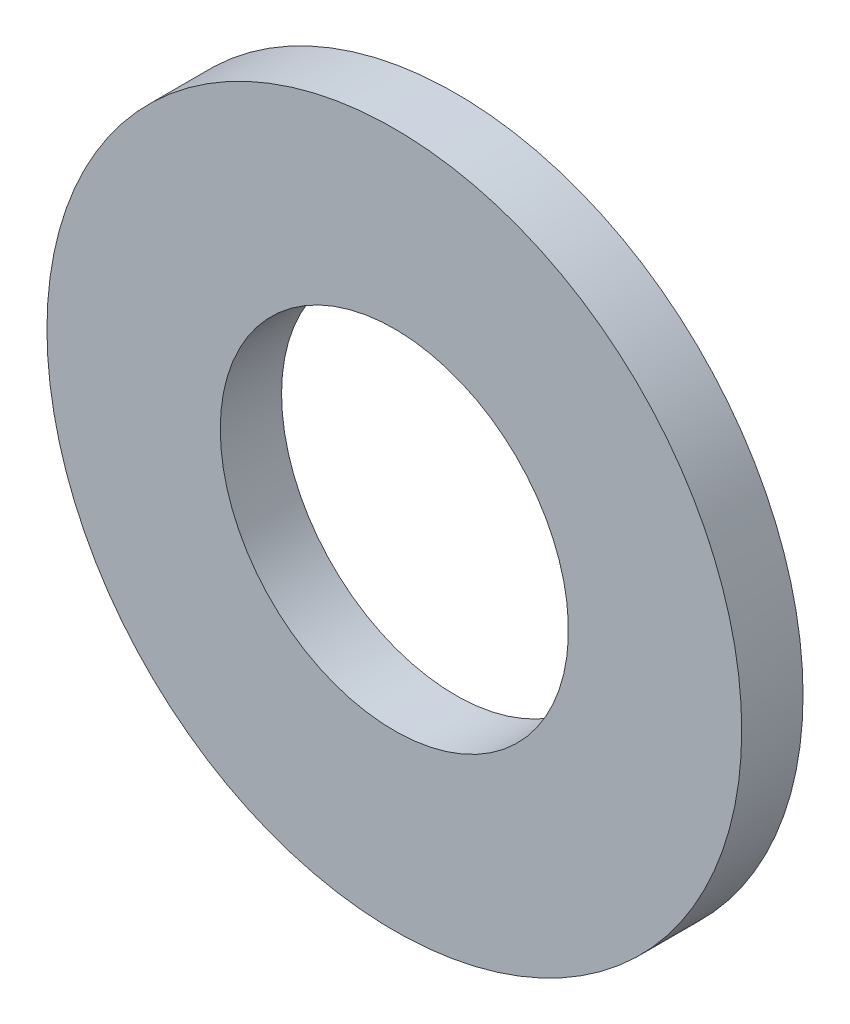
ISO-10303-21;
HEADER;
FILE_DESCRIPTION(('STEP AP214'),'2;1');
FILE_NAME('part.step','',(''),(''),'','','');
FILE_SCHEMA(('AUTOMOTIVE_DESIGN { 1 0 10303 214 1 1 1 1 }'));
ENDSEC;
DATA;
#1=APPLICATION_CONTEXT('core data for automotive mechanical design processes');
#2=APPLICATION_PROTOCOL_DEFINITION('international standard','automotive_design',2000,#1);
#3=PRODUCT_CONTEXT('',#1,'mechanical');
#4=PRODUCT('Part','Part','',(#3));
#5=PRODUCT_RELATED_PRODUCT_CATEGORY('part','',(#4));
#6=PRODUCT_DEFINITION_FORMATION('','',#4);
#7=PRODUCT_DEFINITION_CONTEXT('part definition',#1,'design');
#8=PRODUCT_DEFINITION('design','',#6,#7);
#9=PRODUCT_DEFINITION_SHAPE('','',#8);
#10=(LENGTH_UNIT() NAMED_UNIT(*) SI_UNIT(.MILLI.,.METRE.));
#11=(NAMED_UNIT(*) PLANE_ANGLE_UNIT() SI_UNIT($,.RADIAN.));
#12=(NAMED_UNIT(*) SI_UNIT($,.STERADIAN.) SOLID_ANGLE_UNIT());
#13=UNCERTAINTY_MEASURE_WITH_UNIT(LENGTH_MEASURE(1.E-05),#10,'distance_accuracy_value','');
#14=(GEOMETRIC_REPRESENTATION_CONTEXT(3) GLOBAL_UNCERTAINTY_ASSIGNED_CONTEXT((#13)) GLOBAL_UNIT_ASSIGNED_CONTEXT((#10,
#11,#12)) REPRESENTATION_CONTEXT('',''));
#15=CARTESIAN_POINT('',(0.,0.,0.));
#16=DIRECTION('',(0.,0.,1.));
#17=DIRECTION('',(1.,0.,0.));
#18=AXIS2_PLACEMENT_3D('',#15,#16,#17);
#19=CARTESIAN_POINT('',(0.,0.,0.78));
#20=DIRECTION('',(0.,0.,1.));
#21=DIRECTION('',(1.,0.,0.));
#22=AXIS2_PLACEMENT_3D('',#19,#20,#21);
#23=PLANE('',#22);
#24=CARTESIAN_POINT('',(0.,0.,0.78));
#25=DIRECTION('',(0.,0.,1.));
#26=DIRECTION('',(1.,0.,0.));
#27=AXIS2_PLACEMENT_3D('',#24,#25,#26);
#28=CIRCLE('',#27,4.42);
#29=CARTESIAN_POINT('',(-4.42,0.,0.78));
#30=VERTEX_POINT('',#29);
#31=EDGE_CURVE('E10',#30,#30,#28,.T.);
#32=ORIENTED_EDGE('',*,*,#31,.T.);
#33=EDGE_LOOP('',(#32));
#34=FACE_BOUND('',#33,.T.);
#35=CARTESIAN_POINT('',(0.,0.,0.78));
#36=DIRECTION('',(0.,0.,1.));
#37=DIRECTION('',(1.,0.,0.));
#38=AXIS2_PLACEMENT_3D('',#35,#36,#37);
#39=CIRCLE('',#38,2.215);
#40=CARTESIAN_POINT('',(-2.215,0.,0.78));
#41=VERTEX_POINT('',#40);
#42=EDGE_CURVE('E43',#41,#41,#39,.T.);
#43=ORIENTED_EDGE('',*,*,#42,.F.);
#44=EDGE_LOOP('',(#43));
#45=FACE_BOUND('',#44,.T.);
#46=ADVANCED_FACE('F32',(#34,#45),#23,.T.);
#47=CARTESIAN_POINT('',(0.,0.,0.));
#48=DIRECTION('',(0.,0.,1.));
#49=DIRECTION('',(1.,0.,0.));
#50=AXIS2_PLACEMENT_3D('',#47,#48,#49);
#51=PLANE('',#50);
#52=CARTESIAN_POINT('',(0.,0.,0.));
#53=DIRECTION('',(0.,0.,1.));
#54=DIRECTION('',(1.,0.,0.));
#55=AXIS2_PLACEMENT_3D('',#52,#53,#54);
#56=CIRCLE('',#55,4.42);
#57=CARTESIAN_POINT('',(-4.42,0.,0.));
#58=VERTEX_POINT('',#57);
#59=EDGE_CURVE('E36',#58,#58,#56,.T.);
#60=ORIENTED_EDGE('',*,*,#59,.F.);
#61=EDGE_LOOP('',(#60));
#62=FACE_BOUND('',#61,.T.);
#63=CARTESIAN_POINT('',(0.,0.,0.));
#64=DIRECTION('',(0.,0.,1.));
#65=DIRECTION('',(1.,0.,0.));
#66=AXIS2_PLACEMENT_3D('',#63,#64,#65);
#67=CIRCLE('',#66,2.215);
#68=CARTESIAN_POINT('',(-2.215,0.,0.));
#69=VERTEX_POINT('',#68);
#70=EDGE_CURVE('E45',#69,#69,#67,.T.);
#71=ORIENTED_EDGE('',*,*,#70,.T.);
#72=EDGE_LOOP('',(#71));
#73=FACE_BOUND('',#72,.T.);
#74=ADVANCED_FACE('F55',(#62,#73),#51,.F.);
#75=CARTESIAN_POINT('',(0.,0.,0.78));
#76=DIRECTION('',(0.,0.,-1.));
#77=DIRECTION('',(-1.,0.,0.));
#78=AXIS2_PLACEMENT_3D('',#75,#76,#77);
#79=CYLINDRICAL_SURFACE('',#78,4.42);
#80=CARTESIAN_POINT('',(-4.42,0.,0.78));
#81=CARTESIAN_POINT('',(-4.42,0.,0.771875));
#82=CARTESIAN_POINT('',(-4.42,0.,0.76375));
#83=CARTESIAN_POINT('',(-4.42,0.,0.7475));
#84=CARTESIAN_POINT('',(-4.42,0.,0.739375));
#85=CARTESIAN_POINT('',(-4.42,0.,0.723125));
#86=CARTESIAN_POINT('',(-4.42,0.,0.715));
#87=CARTESIAN_POINT('',(-4.42,0.,0.69875));
#88=CARTESIAN_POINT('',(-4.42,0.,0.690625));
#89=CARTESIAN_POINT('',(-4.42,0.,0.674375));
#90=CARTESIAN_POINT('',(-4.42,0.,0.66625));
#91=CARTESIAN_POINT('',(-4.42,0.,0.65));
#92=CARTESIAN_POINT('',(-4.42,0.,0.641875));
#93=CARTESIAN_POINT('',(-4.42,0.,0.625625));
#94=CARTESIAN_POINT('',(-4.42,0.,0.6175));
#95=CARTESIAN_POINT('',(-4.42,0.,0.60125));
#96=CARTESIAN_POINT('',(-4.42,0.,0.593125));
#97=CARTESIAN_POINT('',(-4.42,0.,0.576875));
#98=CARTESIAN_POINT('',(-4.42,0.,0.56875));
#99=CARTESIAN_POINT('',(-4.42,0.,0.5525));
#100=CARTESIAN_POINT('',(-4.42,0.,0.544375));
#101=CARTESIAN_POINT('',(-4.42,0.,0.528125));
#102=CARTESIAN_POINT('',(-4.42,0.,0.52));
#103=CARTESIAN_POINT('',(-4.42,0.,0.50375));
#104=CARTESIAN_POINT('',(-4.42,0.,0.495625));
#105=CARTESIAN_POINT('',(-4.42,0.,0.479375));
#106=CARTESIAN_POINT('',(-4.42,0.,0.47125));
#107=CARTESIAN_POINT('',(-4.42,0.,0.455));
#108=CARTESIAN_POINT('',(-4.42,0.,0.446875));
#109=CARTESIAN_POINT('',(-4.42,0.,0.430625));
#110=CARTESIAN_POINT('',(-4.42,0.,0.4225));
#111=CARTESIAN_POINT('',(-4.42,0.,0.40625));
#112=CARTESIAN_POINT('',(-4.42,0.,0.398125));
#113=CARTESIAN_POINT('',(-4.42,0.,0.381875));
#114=CARTESIAN_POINT('',(-4.42,0.,0.37375));
#115=CARTESIAN_POINT('',(-4.42,0.,0.3575));
#116=CARTESIAN_POINT('',(-4.42,0.,0.349375));
#117=CARTESIAN_POINT('',(-4.42,0.,0.333125));
#118=CARTESIAN_POINT('',(-4.42,0.,0.325));
#119=CARTESIAN_POINT('',(-4.42,0.,0.30875));
#120=CARTESIAN_POINT('',(-4.42,0.,0.300625));
#121=CARTESIAN_POINT('',(-4.42,0.,0.284375));
#122=CARTESIAN_POINT('',(-4.42,0.,0.27625));
#123=CARTESIAN_POINT('',(-4.42,0.,0.26));
#124=CARTESIAN_POINT('',(-4.42,0.,0.251875));
#125=CARTESIAN_POINT('',(-4.42,0.,0.235625));
#126=CARTESIAN_POINT('',(-4.42,0.,0.2275));
#127=CARTESIAN_POINT('',(-4.42,0.,0.21125));
#128=CARTESIAN_POINT('',(-4.42,0.,0.203125));
#129=CARTESIAN_POINT('',(-4.42,0.,0.186875));
#130=CARTESIAN_POINT('',(-4.42,0.,0.17875));
#131=CARTESIAN_POINT('',(-4.42,0.,0.1625));
#132=CARTESIAN_POINT('',(-4.42,0.,0.154375));
#133=CARTESIAN_POINT('',(-4.42,0.,0.138125));
#134=CARTESIAN_POINT('',(-4.42,0.,0.13));
#135=CARTESIAN_POINT('',(-4.42,0.,0.11375));
#136=CARTESIAN_POINT('',(-4.42,0.,0.105625));
#137=CARTESIAN_POINT('',(-4.42,0.,0.089375));
#138=CARTESIAN_POINT('',(-4.42,0.,0.08125));
#139=CARTESIAN_POINT('',(-4.42,0.,0.0649999999999999));
#140=CARTESIAN_POINT('',(-4.42,0.,0.056875));
#141=CARTESIAN_POINT('',(-4.42,0.,0.040625));
#142=CARTESIAN_POINT('',(-4.42,0.,0.0325));
#143=CARTESIAN_POINT('',(-4.42,0.,0.01625));
#144=CARTESIAN_POINT('',(-4.42,0.,0.00812499999999999));
#145=CARTESIAN_POINT('',(-4.42,0.,0.));
#146=B_SPLINE_CURVE_WITH_KNOTS('',3,(#80,#81,#82,#83,#84,#85,#86,#87,#88,#89,#90,#91,#92,#93,
#94,#95,#96,#97,#98,#99,#100,#101,#102,#103,#104,#105,#106,#107,#108,#109,#110,#111,#112,#113,
#114,#115,#116,#117,#118,#119,#120,#121,#122,#123,#124,#125,#126,#127,#128,#129,#130,#131,#132,
#133,#134,#135,#136,#137,#138,#139,#140,#141,#142,#143,#144,#145),.UNSPECIFIED.,.F.,.F.,(4,2,2,
2,2,2,2,2,2,2,2,2,2,2,2,2,2,2,2,2,2,2,2,2,2,2,2,2,2,2,2,2,4),(0.,0.024375,0.04875,0.073125,
0.0974999999999999,0.121875,0.14625,0.170625,0.195,0.219375,0.24375,0.268125,0.2925,0.316875,
0.34125,0.365625,0.39,0.414375,0.43875,0.463125,0.4875,0.511875,0.53625,0.560625,0.585,0.609375,
0.63375,0.658125,0.6825,0.706875,0.73125,0.755625,0.78),.UNSPECIFIED.);
#147=EDGE_CURVE('BSEAM34',#30,#58,#146,.T.);
#148=ORIENTED_EDGE('',*,*,#31,.F.);
#149=ORIENTED_EDGE('',*,*,#59,.T.);
#150=ORIENTED_EDGE('',*,*,#147,.T.);
#151=ORIENTED_EDGE('',*,*,#147,.F.);
#152=EDGE_LOOP('',(#148,#150,#149,#151));
#153=FACE_BOUND('',#152,.T.);
#154=ADVANCED_FACE('F34',(#153),#79,.T.);
#155=CARTESIAN_POINT('',(0.,0.,0.78));
#156=DIRECTION('',(0.,0.,-1.));
#157=DIRECTION('',(-1.,0.,0.));
#158=AXIS2_PLACEMENT_3D('',#155,#156,#157);
#159=CYLINDRICAL_SURFACE('',#158,2.215);
#160=CARTESIAN_POINT('',(-2.215,0.,0.78));
#161=CARTESIAN_POINT('',(-2.215,0.,0.771875));
#162=CARTESIAN_POINT('',(-2.215,0.,0.76375));
#163=CARTESIAN_POINT('',(-2.215,0.,0.7475));
#164=CARTESIAN_POINT('',(-2.215,0.,0.739375));
#165=CARTESIAN_POINT('',(-2.215,0.,0.723125));
#166=CARTESIAN_POINT('',(-2.215,0.,0.715));
#167=CARTESIAN_POINT('',(-2.215,0.,0.69875));
#168=CARTESIAN_POINT('',(-2.215,0.,0.690625));
#169=CARTESIAN_POINT('',(-2.215,0.,0.674375));
#170=CARTESIAN_POINT('',(-2.215,0.,0.66625));
#171=CARTESIAN_POINT('',(-2.215,0.,0.65));
#172=CARTESIAN_POINT('',(-2.215,0.,0.641875));
#173=CARTESIAN_POINT('',(-2.215,0.,0.625625));
#174=CARTESIAN_POINT('',(-2.215,0.,0.6175));
#175=CARTESIAN_POINT('',(-2.215,0.,0.60125));
#176=CARTESIAN_POINT('',(-2.215,0.,0.593125));
#177=CARTESIAN_POINT('',(-2.215,0.,0.576875));
#178=CARTESIAN_POINT('',(-2.215,0.,0.56875));
#179=CARTESIAN_POINT('',(-2.215,0.,0.5525));
#180=CARTESIAN_POINT('',(-2.215,0.,0.544375));
#181=CARTESIAN_POINT('',(-2.215,0.,0.528125));
#182=CARTESIAN_POINT('',(-2.215,0.,0.52));
#183=CARTESIAN_POINT('',(-2.215,0.,0.50375));
#184=CARTESIAN_POINT('',(-2.215,0.,0.495625));
#185=CARTESIAN_POINT('',(-2.215,0.,0.479375));
#186=CARTESIAN_POINT('',(-2.215,0.,0.47125));
#187=CARTESIAN_POINT('',(-2.215,0.,0.455));
#188=CARTESIAN_POINT('',(-2.215,0.,0.446875));
#189=CARTESIAN_POINT('',(-2.215,0.,0.430625));
#190=CARTESIAN_POINT('',(-2.215,0.,0.4225));
#191=CARTESIAN_POINT('',(-2.215,0.,0.40625));
#192=CARTESIAN_POINT('',(-2.215,0.,0.398125));
#193=CARTESIAN_POINT('',(-2.215,0.,0.381875));
#194=CARTESIAN_POINT('',(-2.215,0.,0.37375));
#195=CARTESIAN_POINT('',(-2.215,0.,0.3575));
#196=CARTESIAN_POINT('',(-2.215,0.,0.349375));
#197=CARTESIAN_POINT('',(-2.215,0.,0.333125));
#198=CARTESIAN_POINT('',(-2.215,0.,0.325));
#199=CARTESIAN_POINT('',(-2.215,0.,0.30875));
#200=CARTESIAN_POINT('',(-2.215,0.,0.300625));
#201=CARTESIAN_POINT('',(-2.215,0.,0.284375));
#202=CARTESIAN_POINT('',(-2.215,0.,0.27625));
#203=CARTESIAN_POINT('',(-2.215,0.,0.26));
#204=CARTESIAN_POINT('',(-2.215,0.,0.251875));
#205=CARTESIAN_POINT('',(-2.215,0.,0.235625));
#206=CARTESIAN_POINT('',(-2.215,0.,0.2275));
#207=CARTESIAN_POINT('',(-2.215,0.,0.21125));
#208=CARTESIAN_POINT('',(-2.215,0.,0.203125));
#209=CARTESIAN_POINT('',(-2.215,0.,0.186875));
#210=CARTESIAN_POINT('',(-2.215,0.,0.17875));
#211=CARTESIAN_POINT('',(-2.215,0.,0.1625));
#212=CARTESIAN_POINT('',(-2.215,0.,0.154375));
#213=CARTESIAN_POINT('',(-2.215,0.,0.138125));
#214=CARTESIAN_POINT('',(-2.215,0.,0.13));
#215=CARTESIAN_POINT('',(-2.215,0.,0.11375));
#216=CARTESIAN_POINT('',(-2.215,0.,0.105625));
#217=CARTESIAN_POINT('',(-2.215,0.,0.089375));
#218=CARTESIAN_POINT('',(-2.215,0.,0.08125));
#219=CARTESIAN_POINT('',(-2.215,0.,0.0649999999999999));
#220=CARTESIAN_POINT('',(-2.215,0.,0.056875));
#221=CARTESIAN_POINT('',(-2.215,0.,0.040625));
#222=CARTESIAN_POINT('',(-2.215,0.,0.0325));
#223=CARTESIAN_POINT('',(-2.215,0.,0.01625));
#224=CARTESIAN_POINT('',(-2.215,0.,0.00812499999999999));
#225=CARTESIAN_POINT('',(-2.215,0.,0.));
#226=B_SPLINE_CURVE_WITH_KNOTS('',3,(#160,#161,#162,#163,#164,#165,#166,#167,#168,#169,#170,
#171,#172,#173,#174,#175,#176,#177,#178,#179,#180,#181,#182,#183,#184,#185,#186,#187,#188,#189,
#190,#191,#192,#193,#194,#195,#196,#197,#198,#199,#200,#201,#202,#203,#204,#205,#206,#207,#208,
#209,#210,#211,#212,#213,#214,#215,#216,#217,#218,#219,#220,#221,#222,#223,#224,#225),
.UNSPECIFIED.,.F.,.F.,(4,2,2,2,2,2,2,2,2,2,2,2,2,2,2,2,2,2,2,2,2,2,2,2,2,2,2,2,2,2,2,2,4),(0.,
0.024375,0.04875,0.073125,0.0974999999999999,0.121875,0.14625,0.170625,0.195,0.219375,0.24375,
0.268125,0.2925,0.316875,0.34125,0.365625,0.39,0.414375,0.43875,0.463125,0.4875,0.511875,
0.53625,0.560625,0.585,0.609375,0.63375,0.658125,0.6825,0.706875,0.73125,0.755625,0.78),.UNSPECIFIED.);
#227=EDGE_CURVE('BSEAM51',#41,#69,#226,.T.);
#228=ORIENTED_EDGE('',*,*,#42,.T.);
#229=ORIENTED_EDGE('',*,*,#70,.F.);
#230=ORIENTED_EDGE('',*,*,#227,.T.);
#231=ORIENTED_EDGE('',*,*,#227,.F.);
#232=EDGE_LOOP('',(#228,#230,#229,#231));
#233=FACE_BOUND('',#232,.T.);
#234=ADVANCED_FACE('F51',(#233),#159,.F.);
#235=CLOSED_SHELL('',(#46,#74,#154,#234));
#236=MANIFOLD_SOLID_BREP('B2',#235);
#237=ADVANCED_BREP_SHAPE_REPRESENTATION('',(#18,#236),#14);
#238=SHAPE_DEFINITION_REPRESENTATION(#9,#237);
ENDSEC;
END-ISO-10303-21;
